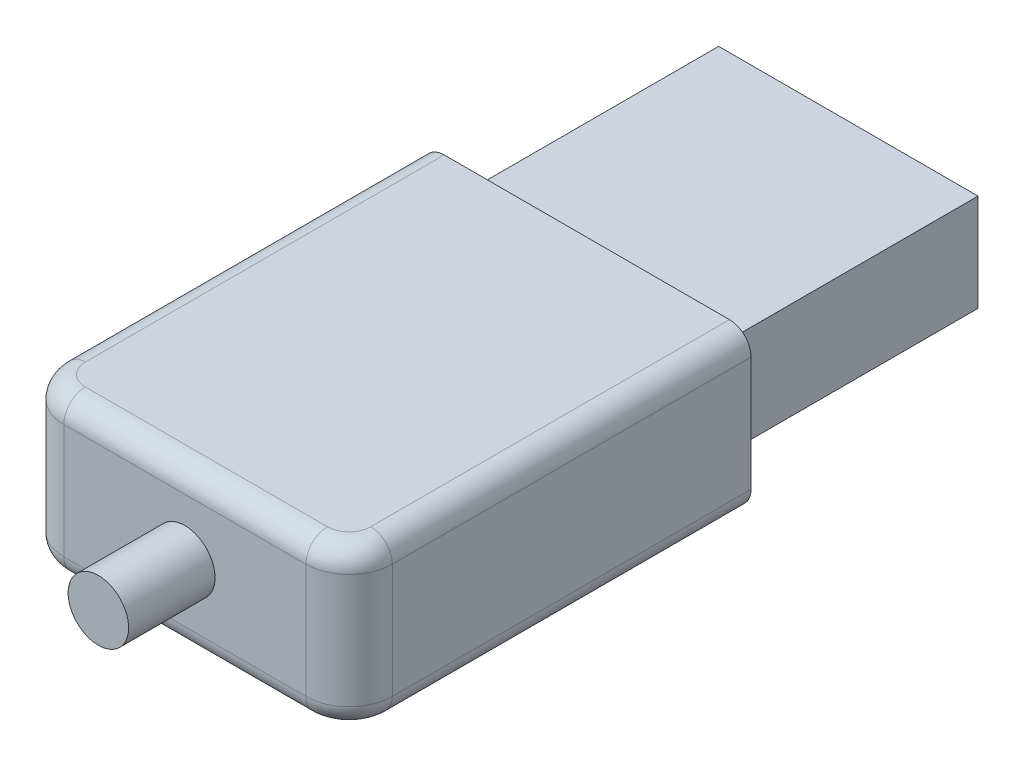
ISO-10303-21;
HEADER;
FILE_DESCRIPTION(('STEP AP214'),'2;1');
FILE_NAME('part.step','',(''),(''),'','','');
FILE_SCHEMA(('AUTOMOTIVE_DESIGN { 1 0 10303 214 1 1 1 1 }'));
ENDSEC;
DATA;
#1=APPLICATION_CONTEXT('core data for automotive mechanical design processes');
#2=APPLICATION_PROTOCOL_DEFINITION('international standard','automotive_design',2000,#1);
#3=PRODUCT_CONTEXT('',#1,'mechanical');
#4=PRODUCT('Part','Part','',(#3));
#5=PRODUCT_RELATED_PRODUCT_CATEGORY('part','',(#4));
#6=PRODUCT_DEFINITION_FORMATION('','',#4);
#7=PRODUCT_DEFINITION_CONTEXT('part definition',#1,'design');
#8=PRODUCT_DEFINITION('design','',#6,#7);
#9=PRODUCT_DEFINITION_SHAPE('','',#8);
#10=(LENGTH_UNIT() NAMED_UNIT(*) SI_UNIT(.MILLI.,.METRE.));
#11=(NAMED_UNIT(*) PLANE_ANGLE_UNIT() SI_UNIT($,.RADIAN.));
#12=(NAMED_UNIT(*) SI_UNIT($,.STERADIAN.) SOLID_ANGLE_UNIT());
#13=UNCERTAINTY_MEASURE_WITH_UNIT(LENGTH_MEASURE(1.E-05),#10,'distance_accuracy_value','');
#14=(GEOMETRIC_REPRESENTATION_CONTEXT(3) GLOBAL_UNCERTAINTY_ASSIGNED_CONTEXT((#13)) GLOBAL_UNIT_ASSIGNED_CONTEXT((#10,
#11,#12)) REPRESENTATION_CONTEXT('',''));
#15=CARTESIAN_POINT('',(0.,0.,0.));
#16=DIRECTION('',(0.,0.,1.));
#17=DIRECTION('',(1.,0.,0.));
#18=AXIS2_PLACEMENT_3D('',#15,#16,#17);
#19=CARTESIAN_POINT('',(0.,0.,0.));
#20=DIRECTION('',(0.,0.,1.));
#21=DIRECTION('',(1.,0.,0.));
#22=AXIS2_PLACEMENT_3D('',#19,#20,#21);
#23=PLANE('',#22);
#24=DIRECTION('',(1.,0.,0.));
#25=VECTOR('',#24,1.);
#26=CARTESIAN_POINT('',(-7.6,-3.65,0.));
#27=LINE('',#26,#25);
#28=CARTESIAN_POINT('',(-6.6,-3.65,0.));
#29=VERTEX_POINT('',#28);
#30=CARTESIAN_POINT('',(6.6,-3.65,0.));
#31=VERTEX_POINT('',#30);
#32=EDGE_CURVE('E260',#29,#31,#27,.T.);
#33=ORIENTED_EDGE('',*,*,#32,.F.);
#34=CARTESIAN_POINT('',(-6.6,-2.65,0.));
#35=DIRECTION('',(0.,0.,1.));
#36=DIRECTION('',(1.,0.,0.));
#37=AXIS2_PLACEMENT_3D('',#34,#35,#36);
#38=CIRCLE('',#37,1.);
#39=CARTESIAN_POINT('',(-7.6,-2.65,0.));
#40=VERTEX_POINT('',#39);
#41=EDGE_CURVE('E12',#29,#40,#38,.F.);
#42=ORIENTED_EDGE('',*,*,#41,.T.);
#43=DIRECTION('',(0.,-1.,0.));
#44=VECTOR('',#43,1.);
#45=CARTESIAN_POINT('',(-7.6,3.65,0.));
#46=LINE('',#45,#44);
#47=CARTESIAN_POINT('',(-7.6,2.65,0.));
#48=VERTEX_POINT('',#47);
#49=EDGE_CURVE('E257',#48,#40,#46,.T.);
#50=ORIENTED_EDGE('',*,*,#49,.F.);
#51=CARTESIAN_POINT('',(-6.6,2.65,0.));
#52=DIRECTION('',(0.,0.,1.));
#53=DIRECTION('',(1.,0.,0.));
#54=AXIS2_PLACEMENT_3D('',#51,#52,#53);
#55=CIRCLE('',#54,1.);
#56=CARTESIAN_POINT('',(-6.6,3.65,0.));
#57=VERTEX_POINT('',#56);
#58=EDGE_CURVE('E306',#48,#57,#55,.F.);
#59=ORIENTED_EDGE('',*,*,#58,.T.);
#60=DIRECTION('',(-1.,0.,0.));
#61=VECTOR('',#60,1.);
#62=CARTESIAN_POINT('',(-7.6,3.65,0.));
#63=LINE('',#62,#61);
#64=CARTESIAN_POINT('',(6.6,3.65,0.));
#65=VERTEX_POINT('',#64);
#66=EDGE_CURVE('E254',#65,#57,#63,.T.);
#67=ORIENTED_EDGE('',*,*,#66,.F.);
#68=CARTESIAN_POINT('',(6.6,2.65,0.));
#69=DIRECTION('',(0.,0.,1.));
#70=DIRECTION('',(1.,0.,0.));
#71=AXIS2_PLACEMENT_3D('',#68,#69,#70);
#72=CIRCLE('',#71,1.);
#73=CARTESIAN_POINT('',(7.6,2.65,0.));
#74=VERTEX_POINT('',#73);
#75=EDGE_CURVE('E308',#65,#74,#72,.F.);
#76=ORIENTED_EDGE('',*,*,#75,.T.);
#77=DIRECTION('',(0.,1.,0.));
#78=VECTOR('',#77,1.);
#79=CARTESIAN_POINT('',(7.6,3.65,0.));
#80=LINE('',#79,#78);
#81=CARTESIAN_POINT('',(7.6,-2.65,0.));
#82=VERTEX_POINT('',#81);
#83=EDGE_CURVE('E251',#82,#74,#80,.T.);
#84=ORIENTED_EDGE('',*,*,#83,.F.);
#85=CARTESIAN_POINT('',(6.6,-2.65,0.));
#86=DIRECTION('',(0.,0.,1.));
#87=DIRECTION('',(1.,0.,0.));
#88=AXIS2_PLACEMENT_3D('',#85,#86,#87);
#89=CIRCLE('',#88,1.);
#90=EDGE_CURVE('E45',#82,#31,#89,.F.);
#91=ORIENTED_EDGE('',*,*,#90,.T.);
#92=EDGE_LOOP('',(#33,#42,#50,#59,#67,#76,#84,#91));
#93=FACE_BOUND('',#92,.T.);
#94=DIRECTION('',(0.,1.,0.));
#95=VECTOR('',#94,1.);
#96=CARTESIAN_POINT('',(-6.,2.25,0.));
#97=LINE('',#96,#95);
#98=CARTESIAN_POINT('',(-6.,-2.25,0.));
#99=VERTEX_POINT('',#98);
#100=CARTESIAN_POINT('',(-6.,2.25,0.));
#101=VERTEX_POINT('',#100);
#102=EDGE_CURVE('E215',#99,#101,#97,.T.);
#103=ORIENTED_EDGE('',*,*,#102,.F.);
#104=DIRECTION('',(-1.,0.,0.));
#105=VECTOR('',#104,1.);
#106=CARTESIAN_POINT('',(6.,-2.25,0.));
#107=LINE('',#106,#105);
#108=CARTESIAN_POINT('',(6.,-2.25,0.));
#109=VERTEX_POINT('',#108);
#110=EDGE_CURVE('E223',#109,#99,#107,.T.);
#111=ORIENTED_EDGE('',*,*,#110,.F.);
#112=DIRECTION('',(0.,-1.,0.));
#113=VECTOR('',#112,1.);
#114=CARTESIAN_POINT('',(6.,2.25,0.));
#115=LINE('',#114,#113);
#116=CARTESIAN_POINT('',(6.,2.25,0.));
#117=VERTEX_POINT('',#116);
#118=EDGE_CURVE('E235',#117,#109,#115,.T.);
#119=ORIENTED_EDGE('',*,*,#118,.F.);
#120=DIRECTION('',(1.,0.,0.));
#121=VECTOR('',#120,1.);
#122=CARTESIAN_POINT('',(6.,2.25,0.));
#123=LINE('',#122,#121);
#124=EDGE_CURVE('E232',#101,#117,#123,.T.);
#125=ORIENTED_EDGE('',*,*,#124,.F.);
#126=EDGE_LOOP('',(#103,#111,#119,#125));
#127=FACE_BOUND('',#126,.T.);
#128=ADVANCED_FACE('F36',(#93,#127),#23,.F.);
#129=CARTESIAN_POINT('',(7.6,3.65,18.6));
#130=DIRECTION('',(-1.,0.,0.));
#131=DIRECTION('',(0.,0.,1.));
#132=AXIS2_PLACEMENT_3D('',#129,#130,#131);
#133=PLANE('',#132);
#134=DIRECTION('',(0.,1.,0.));
#135=VECTOR('',#134,1.);
#136=CARTESIAN_POINT('',(7.6,-3.65,16.6));
#137=LINE('',#136,#135);
#138=CARTESIAN_POINT('',(7.6,2.65,16.6));
#139=VERTEX_POINT('',#138);
#140=CARTESIAN_POINT('',(7.6,-2.65,16.6));
#141=VERTEX_POINT('',#140);
#142=EDGE_CURVE('E274',#139,#141,#137,.F.);
#143=ORIENTED_EDGE('',*,*,#142,.T.);
#144=DIRECTION('',(0.,0.,-1.));
#145=VECTOR('',#144,1.);
#146=CARTESIAN_POINT('',(7.6,-2.65,18.6));
#147=LINE('',#146,#145);
#148=EDGE_CURVE('E277',#141,#82,#147,.T.);
#149=ORIENTED_EDGE('',*,*,#148,.T.);
#150=ORIENTED_EDGE('',*,*,#83,.T.);
#151=DIRECTION('',(0.,0.,-1.));
#152=VECTOR('',#151,1.);
#153=CARTESIAN_POINT('',(7.6,2.65,18.6));
#154=LINE('',#153,#152);
#155=EDGE_CURVE('E272',#74,#139,#154,.F.);
#156=ORIENTED_EDGE('',*,*,#155,.T.);
#157=EDGE_LOOP('',(#143,#149,#150,#156));
#158=FACE_BOUND('',#157,.T.);
#159=ADVANCED_FACE('F374',(#158),#133,.F.);
#160=CARTESIAN_POINT('',(-7.6,3.65,18.6));
#161=DIRECTION('',(0.,-1.,0.));
#162=DIRECTION('',(0.,0.,-1.));
#163=AXIS2_PLACEMENT_3D('',#160,#161,#162);
#164=PLANE('',#163);
#165=CARTESIAN_POINT('',(5.6,3.65,16.6));
#166=DIRECTION('',(0.,-1.,0.));
#167=DIRECTION('',(0.,0.,-1.));
#168=AXIS2_PLACEMENT_3D('',#165,#166,#167);
#169=CIRCLE('',#168,1.);
#170=CARTESIAN_POINT('',(6.6,3.65,16.6));
#171=VERTEX_POINT('',#170);
#172=CARTESIAN_POINT('',(5.6,3.65,17.6));
#173=VERTEX_POINT('',#172);
#174=EDGE_CURVE('E292',#171,#173,#169,.T.);
#175=ORIENTED_EDGE('',*,*,#174,.F.);
#176=DIRECTION('',(0.,0.,-1.));
#177=VECTOR('',#176,1.);
#178=CARTESIAN_POINT('',(6.6,3.65,18.6));
#179=LINE('',#178,#177);
#180=EDGE_CURVE('E295',#171,#65,#179,.T.);
#181=ORIENTED_EDGE('',*,*,#180,.T.);
#182=ORIENTED_EDGE('',*,*,#66,.T.);
#183=DIRECTION('',(0.,0.,-1.));
#184=VECTOR('',#183,1.);
#185=CARTESIAN_POINT('',(-6.6,3.65,18.6));
#186=LINE('',#185,#184);
#187=CARTESIAN_POINT('',(-6.6,3.65,16.6));
#188=VERTEX_POINT('',#187);
#189=EDGE_CURVE('E288',#57,#188,#186,.F.);
#190=ORIENTED_EDGE('',*,*,#189,.T.);
#191=CARTESIAN_POINT('',(-5.6,3.65,16.6));
#192=DIRECTION('',(0.,-1.,0.));
#193=DIRECTION('',(0.,0.,-1.));
#194=AXIS2_PLACEMENT_3D('',#191,#192,#193);
#195=CIRCLE('',#194,1.);
#196=CARTESIAN_POINT('',(-5.6,3.65,17.6));
#197=VERTEX_POINT('',#196);
#198=EDGE_CURVE('E285',#197,#188,#195,.T.);
#199=ORIENTED_EDGE('',*,*,#198,.F.);
#200=DIRECTION('',(-1.,0.,0.));
#201=VECTOR('',#200,1.);
#202=CARTESIAN_POINT('',(7.6,3.65,17.6));
#203=LINE('',#202,#201);
#204=EDGE_CURVE('E290',#197,#173,#203,.F.);
#205=ORIENTED_EDGE('',*,*,#204,.T.);
#206=EDGE_LOOP('',(#175,#181,#182,#190,#199,#205));
#207=FACE_BOUND('',#206,.T.);
#208=ADVANCED_FACE('F379',(#207),#164,.F.);
#209=CARTESIAN_POINT('',(-7.6,3.65,18.6));
#210=DIRECTION('',(1.,0.,0.));
#211=DIRECTION('',(0.,1.,0.));
#212=AXIS2_PLACEMENT_3D('',#209,#210,#211);
#213=PLANE('',#212);
#214=ORIENTED_EDGE('',*,*,#49,.T.);
#215=DIRECTION('',(0.,0.,-1.));
#216=VECTOR('',#215,1.);
#217=CARTESIAN_POINT('',(-7.6,-2.65,18.6));
#218=LINE('',#217,#216);
#219=CARTESIAN_POINT('',(-7.6,-2.65,16.6));
#220=VERTEX_POINT('',#219);
#221=EDGE_CURVE('E283',#40,#220,#218,.F.);
#222=ORIENTED_EDGE('',*,*,#221,.T.);
#223=DIRECTION('',(0.,-1.,0.));
#224=VECTOR('',#223,1.);
#225=CARTESIAN_POINT('',(-7.6,3.65,16.6));
#226=LINE('',#225,#224);
#227=CARTESIAN_POINT('',(-7.6,2.65,16.6));
#228=VERTEX_POINT('',#227);
#229=EDGE_CURVE('E281',#220,#228,#226,.F.);
#230=ORIENTED_EDGE('',*,*,#229,.T.);
#231=DIRECTION('',(0.,0.,-1.));
#232=VECTOR('',#231,1.);
#233=CARTESIAN_POINT('',(-7.6,2.65,18.6));
#234=LINE('',#233,#232);
#235=EDGE_CURVE('E279',#228,#48,#234,.T.);
#236=ORIENTED_EDGE('',*,*,#235,.T.);
#237=EDGE_LOOP('',(#214,#222,#230,#236));
#238=FACE_BOUND('',#237,.T.);
#239=ADVANCED_FACE('F370',(#238),#213,.F.);
#240=CARTESIAN_POINT('',(-7.6,-3.65,18.6));
#241=DIRECTION('',(0.,1.,0.));
#242=DIRECTION('',(0.,0.,1.));
#243=AXIS2_PLACEMENT_3D('',#240,#241,#242);
#244=PLANE('',#243);
#245=CARTESIAN_POINT('',(-5.6,-3.65,16.6));
#246=DIRECTION('',(0.,1.,0.));
#247=DIRECTION('',(0.,0.,1.));
#248=AXIS2_PLACEMENT_3D('',#245,#246,#247);
#249=CIRCLE('',#248,1.);
#250=CARTESIAN_POINT('',(-6.6,-3.65,16.6));
#251=VERTEX_POINT('',#250);
#252=CARTESIAN_POINT('',(-5.6,-3.65,17.6));
#253=VERTEX_POINT('',#252);
#254=EDGE_CURVE('E53',#251,#253,#249,.T.);
#255=ORIENTED_EDGE('',*,*,#254,.F.);
#256=DIRECTION('',(0.,0.,-1.));
#257=VECTOR('',#256,1.);
#258=CARTESIAN_POINT('',(-6.6,-3.65,18.6));
#259=LINE('',#258,#257);
#260=EDGE_CURVE('E304',#251,#29,#259,.T.);
#261=ORIENTED_EDGE('',*,*,#260,.T.);
#262=ORIENTED_EDGE('',*,*,#32,.T.);
#263=DIRECTION('',(0.,0.,-1.));
#264=VECTOR('',#263,1.);
#265=CARTESIAN_POINT('',(6.6,-3.65,18.6));
#266=LINE('',#265,#264);
#267=CARTESIAN_POINT('',(6.6,-3.65,16.6));
#268=VERTEX_POINT('',#267);
#269=EDGE_CURVE('E300',#31,#268,#266,.F.);
#270=ORIENTED_EDGE('',*,*,#269,.T.);
#271=CARTESIAN_POINT('',(5.6,-3.65,16.6));
#272=DIRECTION('',(0.,1.,0.));
#273=DIRECTION('',(0.,0.,1.));
#274=AXIS2_PLACEMENT_3D('',#271,#272,#273);
#275=CIRCLE('',#274,1.);
#276=CARTESIAN_POINT('',(5.6,-3.65,17.6));
#277=VERTEX_POINT('',#276);
#278=EDGE_CURVE('E297',#277,#268,#275,.T.);
#279=ORIENTED_EDGE('',*,*,#278,.F.);
#280=DIRECTION('',(1.,0.,0.));
#281=VECTOR('',#280,1.);
#282=CARTESIAN_POINT('',(-7.6,-3.65,17.6));
#283=LINE('',#282,#281);
#284=EDGE_CURVE('E58',#277,#253,#283,.F.);
#285=ORIENTED_EDGE('',*,*,#284,.T.);
#286=EDGE_LOOP('',(#255,#261,#262,#270,#279,#285));
#287=FACE_BOUND('',#286,.T.);
#288=ADVANCED_FACE('F360',(#287),#244,.F.);
#289=CARTESIAN_POINT('',(0.,0.,18.6));
#290=DIRECTION('',(0.,0.,1.));
#291=DIRECTION('',(1.,0.,0.));
#292=AXIS2_PLACEMENT_3D('',#289,#290,#291);
#293=PLANE('',#292);
#294=DIRECTION('',(0.,1.,0.));
#295=VECTOR('',#294,1.);
#296=CARTESIAN_POINT('',(5.6,3.65,18.6));
#297=LINE('',#296,#295);
#298=CARTESIAN_POINT('',(5.6,-2.65,18.6));
#299=VERTEX_POINT('',#298);
#300=CARTESIAN_POINT('',(5.6,2.65,18.6));
#301=VERTEX_POINT('',#300);
#302=EDGE_CURVE('E267',#299,#301,#297,.T.);
#303=ORIENTED_EDGE('',*,*,#302,.T.);
#304=DIRECTION('',(-1.,0.,0.));
#305=VECTOR('',#304,1.);
#306=CARTESIAN_POINT('',(-7.6,2.65,18.6));
#307=LINE('',#306,#305);
#308=CARTESIAN_POINT('',(-5.6,2.65,18.6));
#309=VERTEX_POINT('',#308);
#310=EDGE_CURVE('E270',#301,#309,#307,.T.);
#311=ORIENTED_EDGE('',*,*,#310,.T.);
#312=DIRECTION('',(0.,-1.,0.));
#313=VECTOR('',#312,1.);
#314=CARTESIAN_POINT('',(-5.6,-3.65,18.6));
#315=LINE('',#314,#313);
#316=CARTESIAN_POINT('',(-5.6,-2.65,18.6));
#317=VERTEX_POINT('',#316);
#318=EDGE_CURVE('E265',#309,#317,#315,.T.);
#319=ORIENTED_EDGE('',*,*,#318,.T.);
#320=DIRECTION('',(1.,0.,0.));
#321=VECTOR('',#320,1.);
#322=CARTESIAN_POINT('',(7.6,-2.65,18.6));
#323=LINE('',#322,#321);
#324=EDGE_CURVE('E263',#317,#299,#323,.T.);
#325=ORIENTED_EDGE('',*,*,#324,.T.);
#326=EDGE_LOOP('',(#303,#311,#319,#325));
#327=FACE_BOUND('',#326,.T.);
#328=CARTESIAN_POINT('',(0.,0.,18.6));
#329=DIRECTION('',(0.,0.,1.));
#330=DIRECTION('',(1.,0.,0.));
#331=AXIS2_PLACEMENT_3D('',#328,#329,#330);
#332=CIRCLE('',#331,1.4);
#333=CARTESIAN_POINT('',(1.4,0.,18.6));
#334=VERTEX_POINT('',#333);
#335=EDGE_CURVE('E202',#334,#334,#332,.T.);
#336=ORIENTED_EDGE('',*,*,#335,.F.);
#337=EDGE_LOOP('',(#336));
#338=FACE_BOUND('',#337,.T.);
#339=ADVANCED_FACE('F357',(#327,#338),#293,.T.);
#340=CARTESIAN_POINT('',(-6.,2.25,-12.1));
#341=DIRECTION('',(1.,0.,0.));
#342=DIRECTION('',(0.,1.,0.));
#343=AXIS2_PLACEMENT_3D('',#340,#341,#342);
#344=PLANE('',#343);
#345=ORIENTED_EDGE('',*,*,#102,.T.);
#346=DIRECTION('',(0.,0.,1.));
#347=VECTOR('',#346,1.);
#348=CARTESIAN_POINT('',(-6.,2.25,-12.1));
#349=LINE('',#348,#347);
#350=CARTESIAN_POINT('',(-6.,2.25,-12.1));
#351=VERTEX_POINT('',#350);
#352=EDGE_CURVE('E248',#351,#101,#349,.T.);
#353=ORIENTED_EDGE('',*,*,#352,.F.);
#354=DIRECTION('',(0.,1.,0.));
#355=VECTOR('',#354,1.);
#356=CARTESIAN_POINT('',(-6.,2.25,-12.1));
#357=LINE('',#356,#355);
#358=CARTESIAN_POINT('',(-6.,-2.25,-12.1));
#359=VERTEX_POINT('',#358);
#360=EDGE_CURVE('E219',#359,#351,#357,.T.);
#361=ORIENTED_EDGE('',*,*,#360,.F.);
#362=DIRECTION('',(0.,0.,1.));
#363=VECTOR('',#362,1.);
#364=CARTESIAN_POINT('',(-6.,-2.25,-12.1));
#365=LINE('',#364,#363);
#366=EDGE_CURVE('E229',#359,#99,#365,.T.);
#367=ORIENTED_EDGE('',*,*,#366,.T.);
#368=EDGE_LOOP('',(#345,#353,#361,#367));
#369=FACE_BOUND('',#368,.T.);
#370=ADVANCED_FACE('F359',(#369),#344,.F.);
#371=CARTESIAN_POINT('',(6.,2.25,-12.1));
#372=DIRECTION('',(0.,-1.,0.));
#373=DIRECTION('',(0.,0.,-1.));
#374=AXIS2_PLACEMENT_3D('',#371,#372,#373);
#375=PLANE('',#374);
#376=ORIENTED_EDGE('',*,*,#124,.T.);
#377=DIRECTION('',(0.,0.,1.));
#378=VECTOR('',#377,1.);
#379=CARTESIAN_POINT('',(6.,2.25,-12.1));
#380=LINE('',#379,#378);
#381=CARTESIAN_POINT('',(6.,2.25,-12.1));
#382=VERTEX_POINT('',#381);
#383=EDGE_CURVE('E245',#382,#117,#380,.T.);
#384=ORIENTED_EDGE('',*,*,#383,.F.);
#385=DIRECTION('',(1.,0.,0.));
#386=VECTOR('',#385,1.);
#387=CARTESIAN_POINT('',(6.,2.25,-12.1));
#388=LINE('',#387,#386);
#389=EDGE_CURVE('E222',#351,#382,#388,.T.);
#390=ORIENTED_EDGE('',*,*,#389,.F.);
#391=ORIENTED_EDGE('',*,*,#352,.T.);
#392=EDGE_LOOP('',(#376,#384,#390,#391));
#393=FACE_BOUND('',#392,.T.);
#394=ADVANCED_FACE('F367',(#393),#375,.F.);
#395=CARTESIAN_POINT('',(6.,2.25,-12.1));
#396=DIRECTION('',(-1.,0.,0.));
#397=DIRECTION('',(0.,-1.,0.));
#398=AXIS2_PLACEMENT_3D('',#395,#396,#397);
#399=PLANE('',#398);
#400=ORIENTED_EDGE('',*,*,#118,.T.);
#401=DIRECTION('',(0.,0.,1.));
#402=VECTOR('',#401,1.);
#403=CARTESIAN_POINT('',(6.,-2.25,-12.1));
#404=LINE('',#403,#402);
#405=CARTESIAN_POINT('',(6.,-2.25,-12.1));
#406=VERTEX_POINT('',#405);
#407=EDGE_CURVE('E242',#406,#109,#404,.T.);
#408=ORIENTED_EDGE('',*,*,#407,.F.);
#409=DIRECTION('',(0.,-1.,0.));
#410=VECTOR('',#409,1.);
#411=CARTESIAN_POINT('',(6.,2.25,-12.1));
#412=LINE('',#411,#410);
#413=EDGE_CURVE('E225',#382,#406,#412,.T.);
#414=ORIENTED_EDGE('',*,*,#413,.F.);
#415=ORIENTED_EDGE('',*,*,#383,.T.);
#416=EDGE_LOOP('',(#400,#408,#414,#415));
#417=FACE_BOUND('',#416,.T.);
#418=ADVANCED_FACE('F494',(#417),#399,.F.);
#419=CARTESIAN_POINT('',(6.,-2.25,-12.1));
#420=DIRECTION('',(0.,1.,0.));
#421=DIRECTION('',(0.,0.,1.));
#422=AXIS2_PLACEMENT_3D('',#419,#420,#421);
#423=PLANE('',#422);
#424=ORIENTED_EDGE('',*,*,#110,.T.);
#425=ORIENTED_EDGE('',*,*,#366,.F.);
#426=DIRECTION('',(-1.,0.,0.));
#427=VECTOR('',#426,1.);
#428=CARTESIAN_POINT('',(6.,-2.25,-12.1));
#429=LINE('',#428,#427);
#430=EDGE_CURVE('E227',#406,#359,#429,.T.);
#431=ORIENTED_EDGE('',*,*,#430,.F.);
#432=ORIENTED_EDGE('',*,*,#407,.T.);
#433=EDGE_LOOP('',(#424,#425,#431,#432));
#434=FACE_BOUND('',#433,.T.);
#435=ADVANCED_FACE('F490',(#434),#423,.F.);
#436=CARTESIAN_POINT('',(0.,0.,-12.1));
#437=DIRECTION('',(0.,0.,-1.));
#438=DIRECTION('',(-1.,0.,0.));
#439=AXIS2_PLACEMENT_3D('',#436,#437,#438);
#440=PLANE('',#439);
#441=DIRECTION('',(0.,-1.,0.));
#442=VECTOR('',#441,1.);
#443=CARTESIAN_POINT('',(5.8,2.05,-12.1));
#444=LINE('',#443,#442);
#445=CARTESIAN_POINT('',(5.8,2.05,-12.1));
#446=VERTEX_POINT('',#445);
#447=CARTESIAN_POINT('',(5.8,-0.15,-12.1));
#448=VERTEX_POINT('',#447);
#449=EDGE_CURVE('E179',#446,#448,#444,.T.);
#450=ORIENTED_EDGE('',*,*,#449,.F.);
#451=DIRECTION('',(1.,0.,0.));
#452=VECTOR('',#451,1.);
#453=CARTESIAN_POINT('',(5.8,2.05,-12.1));
#454=LINE('',#453,#452);
#455=CARTESIAN_POINT('',(-5.8,2.05,-12.1));
#456=VERTEX_POINT('',#455);
#457=EDGE_CURVE('E196',#456,#446,#454,.T.);
#458=ORIENTED_EDGE('',*,*,#457,.F.);
#459=DIRECTION('',(0.,1.,0.));
#460=VECTOR('',#459,1.);
#461=CARTESIAN_POINT('',(-5.8,2.05,-12.1));
#462=LINE('',#461,#460);
#463=CARTESIAN_POINT('',(-5.8,-0.15,-12.1));
#464=VERTEX_POINT('',#463);
#465=EDGE_CURVE('E199',#464,#456,#462,.T.);
#466=ORIENTED_EDGE('',*,*,#465,.F.);
#467=DIRECTION('',(-1.,0.,0.));
#468=VECTOR('',#467,1.);
#469=CARTESIAN_POINT('',(5.8,-0.15,-12.1));
#470=LINE('',#469,#468);
#471=EDGE_CURVE('E208',#448,#464,#470,.T.);
#472=ORIENTED_EDGE('',*,*,#471,.F.);
#473=EDGE_LOOP('',(#450,#458,#466,#472));
#474=FACE_BOUND('',#473,.T.);
#475=ORIENTED_EDGE('',*,*,#360,.T.);
#476=ORIENTED_EDGE('',*,*,#389,.T.);
#477=ORIENTED_EDGE('',*,*,#413,.T.);
#478=ORIENTED_EDGE('',*,*,#430,.T.);
#479=EDGE_LOOP('',(#475,#476,#477,#478));
#480=FACE_BOUND('',#479,.T.);
#481=ADVANCED_FACE('F487',(#474,#480),#440,.T.);
#482=CARTESIAN_POINT('',(5.8,2.05,-3.1));
#483=DIRECTION('',(1.,0.,0.));
#484=DIRECTION('',(0.,1.,0.));
#485=AXIS2_PLACEMENT_3D('',#482,#483,#484);
#486=PLANE('',#485);
#487=ORIENTED_EDGE('',*,*,#449,.T.);
#488=DIRECTION('',(0.,0.,-1.));
#489=VECTOR('',#488,1.);
#490=CARTESIAN_POINT('',(5.8,-0.15,-3.1));
#491=LINE('',#490,#489);
#492=CARTESIAN_POINT('',(5.8,-0.15,-3.1));
#493=VERTEX_POINT('',#492);
#494=EDGE_CURVE('E172',#493,#448,#491,.T.);
#495=ORIENTED_EDGE('',*,*,#494,.F.);
#496=DIRECTION('',(0.,-1.,0.));
#497=VECTOR('',#496,1.);
#498=CARTESIAN_POINT('',(5.8,2.05,-3.1));
#499=LINE('',#498,#497);
#500=CARTESIAN_POINT('',(5.8,2.05,-3.1));
#501=VERTEX_POINT('',#500);
#502=EDGE_CURVE('E176',#501,#493,#499,.T.);
#503=ORIENTED_EDGE('',*,*,#502,.F.);
#504=DIRECTION('',(0.,0.,-1.));
#505=VECTOR('',#504,1.);
#506=CARTESIAN_POINT('',(5.8,2.05,-3.1));
#507=LINE('',#506,#505);
#508=EDGE_CURVE('E213',#501,#446,#507,.T.);
#509=ORIENTED_EDGE('',*,*,#508,.T.);
#510=EDGE_LOOP('',(#487,#495,#503,#509));
#511=FACE_BOUND('',#510,.T.);
#512=ADVANCED_FACE('F174',(#511),#486,.F.);
#513=CARTESIAN_POINT('',(5.8,2.05,-3.1));
#514=DIRECTION('',(0.,1.,0.));
#515=DIRECTION('',(0.,0.,1.));
#516=AXIS2_PLACEMENT_3D('',#513,#514,#515);
#517=PLANE('',#516);
#518=ORIENTED_EDGE('',*,*,#457,.T.);
#519=ORIENTED_EDGE('',*,*,#508,.F.);
#520=DIRECTION('',(1.,0.,0.));
#521=VECTOR('',#520,1.);
#522=CARTESIAN_POINT('',(5.8,2.05,-3.1));
#523=LINE('',#522,#521);
#524=CARTESIAN_POINT('',(-5.8,2.05,-3.1));
#525=VERTEX_POINT('',#524);
#526=EDGE_CURVE('E184',#525,#501,#523,.T.);
#527=ORIENTED_EDGE('',*,*,#526,.F.);
#528=DIRECTION('',(0.,0.,-1.));
#529=VECTOR('',#528,1.);
#530=CARTESIAN_POINT('',(-5.8,2.05,-3.1));
#531=LINE('',#530,#529);
#532=EDGE_CURVE('E216',#525,#456,#531,.T.);
#533=ORIENTED_EDGE('',*,*,#532,.T.);
#534=EDGE_LOOP('',(#518,#519,#527,#533));
#535=FACE_BOUND('',#534,.T.);
#536=ADVANCED_FACE('F475',(#535),#517,.F.);
#537=CARTESIAN_POINT('',(-5.8,2.05,-3.1));
#538=DIRECTION('',(-1.,0.,0.));
#539=DIRECTION('',(0.,0.,1.));
#540=AXIS2_PLACEMENT_3D('',#537,#538,#539);
#541=PLANE('',#540);
#542=ORIENTED_EDGE('',*,*,#465,.T.);
#543=ORIENTED_EDGE('',*,*,#532,.F.);
#544=DIRECTION('',(0.,1.,0.));
#545=VECTOR('',#544,1.);
#546=CARTESIAN_POINT('',(-5.8,2.05,-3.1));
#547=LINE('',#546,#545);
#548=CARTESIAN_POINT('',(-5.8,-0.15,-3.1));
#549=VERTEX_POINT('',#548);
#550=EDGE_CURVE('E192',#549,#525,#547,.T.);
#551=ORIENTED_EDGE('',*,*,#550,.F.);
#552=DIRECTION('',(0.,0.,-1.));
#553=VECTOR('',#552,1.);
#554=CARTESIAN_POINT('',(-5.8,-0.15,-3.1));
#555=LINE('',#554,#553);
#556=EDGE_CURVE('E183',#549,#464,#555,.T.);
#557=ORIENTED_EDGE('',*,*,#556,.T.);
#558=EDGE_LOOP('',(#542,#543,#551,#557));
#559=FACE_BOUND('',#558,.T.);
#560=ADVANCED_FACE('F478',(#559),#541,.F.);
#561=CARTESIAN_POINT('',(5.8,-0.15,-3.1));
#562=DIRECTION('',(0.,-1.,0.));
#563=DIRECTION('',(0.,0.,-1.));
#564=AXIS2_PLACEMENT_3D('',#561,#562,#563);
#565=PLANE('',#564);
#566=ORIENTED_EDGE('',*,*,#471,.T.);
#567=ORIENTED_EDGE('',*,*,#556,.F.);
#568=DIRECTION('',(-1.,0.,0.));
#569=VECTOR('',#568,1.);
#570=CARTESIAN_POINT('',(5.8,-0.15,-3.1));
#571=LINE('',#570,#569);
#572=EDGE_CURVE('E187',#493,#549,#571,.T.);
#573=ORIENTED_EDGE('',*,*,#572,.F.);
#574=ORIENTED_EDGE('',*,*,#494,.T.);
#575=EDGE_LOOP('',(#566,#567,#573,#574));
#576=FACE_BOUND('',#575,.T.);
#577=ADVANCED_FACE('F188',(#576),#565,.F.);
#578=CARTESIAN_POINT('',(0.,0.,-3.1));
#579=DIRECTION('',(0.,0.,-1.));
#580=DIRECTION('',(-1.,0.,0.));
#581=AXIS2_PLACEMENT_3D('',#578,#579,#580);
#582=PLANE('',#581);
#583=ORIENTED_EDGE('',*,*,#502,.T.);
#584=ORIENTED_EDGE('',*,*,#572,.T.);
#585=ORIENTED_EDGE('',*,*,#550,.T.);
#586=ORIENTED_EDGE('',*,*,#526,.T.);
#587=EDGE_LOOP('',(#583,#584,#585,#586));
#588=FACE_BOUND('',#587,.T.);
#589=ADVANCED_FACE('F194',(#588),#582,.T.);
#590=CARTESIAN_POINT('',(0.,0.,22.6));
#591=DIRECTION('',(0.,0.,-1.));
#592=DIRECTION('',(-1.,0.,0.));
#593=AXIS2_PLACEMENT_3D('',#590,#591,#592);
#594=CYLINDRICAL_SURFACE('',#593,1.4);
#595=CARTESIAN_POINT('',(0.,0.,22.6));
#596=DIRECTION('',(0.,0.,1.));
#597=DIRECTION('',(1.,0.,0.));
#598=AXIS2_PLACEMENT_3D('',#595,#596,#597);
#599=CIRCLE('',#598,1.4);
#600=CARTESIAN_POINT('',(1.4,0.,22.6));
#601=VERTEX_POINT('',#600);
#602=EDGE_CURVE('E209',#601,#601,#599,.T.);
#603=ORIENTED_EDGE('',*,*,#602,.F.);
#604=EDGE_LOOP('',(#603));
#605=FACE_BOUND('',#604,.T.);
#606=ORIENTED_EDGE('',*,*,#335,.T.);
#607=EDGE_LOOP('',(#606));
#608=FACE_BOUND('',#607,.T.);
#609=ADVANCED_FACE('F350',(#605,#608),#594,.T.);
#610=CARTESIAN_POINT('',(0.,0.,22.6));
#611=DIRECTION('',(0.,0.,1.));
#612=DIRECTION('',(1.,0.,0.));
#613=AXIS2_PLACEMENT_3D('',#610,#611,#612);
#614=PLANE('',#613);
#615=ORIENTED_EDGE('',*,*,#602,.T.);
#616=EDGE_LOOP('',(#615));
#617=FACE_BOUND('',#616,.T.);
#618=ADVANCED_FACE('F348',(#617),#614,.T.);
#619=CARTESIAN_POINT('',(-6.6,-2.65,18.6));
#620=DIRECTION('',(0.,0.,-1.));
#621=DIRECTION('',(-1.,0.,0.));
#622=AXIS2_PLACEMENT_3D('',#619,#620,#621);
#623=CYLINDRICAL_SURFACE('',#622,1.);
#624=ORIENTED_EDGE('',*,*,#41,.F.);
#625=ORIENTED_EDGE('',*,*,#260,.F.);
#626=CARTESIAN_POINT('',(-6.6,-2.65,16.6));
#627=DIRECTION('',(0.,0.,1.));
#628=DIRECTION('',(1.,0.,0.));
#629=AXIS2_PLACEMENT_3D('',#626,#627,#628);
#630=CIRCLE('',#629,1.);
#631=EDGE_CURVE('E40',#220,#251,#630,.T.);
#632=ORIENTED_EDGE('',*,*,#631,.F.);
#633=ORIENTED_EDGE('',*,*,#221,.F.);
#634=EDGE_LOOP('',(#624,#625,#632,#633));
#635=FACE_BOUND('',#634,.T.);
#636=ADVANCED_FACE('F38',(#635),#623,.T.);
#637=CARTESIAN_POINT('',(-5.6,0.,16.6));
#638=DIRECTION('',(0.,1.,0.));
#639=DIRECTION('',(-1.,0.,0.));
#640=AXIS2_PLACEMENT_3D('',#637,#638,#639);
#641=CYLINDRICAL_SURFACE('',#640,2.);
#642=CARTESIAN_POINT('',(-5.6,2.65,16.6));
#643=DIRECTION('',(0.,-1.,0.));
#644=DIRECTION('',(0.,0.,-1.));
#645=AXIS2_PLACEMENT_3D('',#642,#643,#644);
#646=CIRCLE('',#645,2.);
#647=EDGE_CURVE('E336',#228,#309,#646,.F.);
#648=ORIENTED_EDGE('',*,*,#647,.F.);
#649=ORIENTED_EDGE('',*,*,#229,.F.);
#650=CARTESIAN_POINT('',(-5.6,-2.65,16.6));
#651=DIRECTION('',(0.,1.,0.));
#652=DIRECTION('',(0.,0.,1.));
#653=AXIS2_PLACEMENT_3D('',#650,#651,#652);
#654=CIRCLE('',#653,2.);
#655=EDGE_CURVE('E338',#317,#220,#654,.F.);
#656=ORIENTED_EDGE('',*,*,#655,.F.);
#657=ORIENTED_EDGE('',*,*,#318,.F.);
#658=EDGE_LOOP('',(#648,#649,#656,#657));
#659=FACE_BOUND('',#658,.T.);
#660=ADVANCED_FACE('F428',(#659),#641,.T.);
#661=CARTESIAN_POINT('',(-6.6,2.65,18.6));
#662=DIRECTION('',(0.,0.,-1.));
#663=DIRECTION('',(-1.,0.,0.));
#664=AXIS2_PLACEMENT_3D('',#661,#662,#663);
#665=CYLINDRICAL_SURFACE('',#664,1.);
#666=ORIENTED_EDGE('',*,*,#58,.F.);
#667=ORIENTED_EDGE('',*,*,#235,.F.);
#668=CARTESIAN_POINT('',(-6.6,2.65,16.6));
#669=DIRECTION('',(0.,0.,1.));
#670=DIRECTION('',(1.,0.,0.));
#671=AXIS2_PLACEMENT_3D('',#668,#669,#670);
#672=CIRCLE('',#671,1.);
#673=EDGE_CURVE('E333',#188,#228,#672,.T.);
#674=ORIENTED_EDGE('',*,*,#673,.F.);
#675=ORIENTED_EDGE('',*,*,#189,.F.);
#676=EDGE_LOOP('',(#666,#667,#674,#675));
#677=FACE_BOUND('',#676,.T.);
#678=ADVANCED_FACE('F426',(#677),#665,.T.);
#679=CARTESIAN_POINT('',(-5.6,-2.65,16.6));
#680=DIRECTION('',(0.,1.,0.));
#681=DIRECTION('',(0.,0.,1.));
#682=AXIS2_PLACEMENT_3D('',#679,#680,#681);
#683=DEGENERATE_TOROIDAL_SURFACE('',#682,1.,1.,.T.);
#684=ORIENTED_EDGE('',*,*,#631,.T.);
#685=ORIENTED_EDGE('',*,*,#254,.T.);
#686=CARTESIAN_POINT('',(-5.6,-2.65,17.6));
#687=DIRECTION('',(-1.,0.,0.));
#688=DIRECTION('',(0.,0.,1.));
#689=AXIS2_PLACEMENT_3D('',#686,#687,#688);
#690=CIRCLE('',#689,1.);
#691=EDGE_CURVE('E330',#317,#253,#690,.F.);
#692=ORIENTED_EDGE('',*,*,#691,.F.);
#693=ORIENTED_EDGE('',*,*,#655,.T.);
#694=EDGE_LOOP('',(#684,#685,#692,#693));
#695=FACE_BOUND('',#694,.T.);
#696=ADVANCED_FACE('F422',(#695),#683,.T.);
#697=CARTESIAN_POINT('',(-5.6,2.65,16.6));
#698=DIRECTION('',(0.,-1.,0.));
#699=DIRECTION('',(0.,0.,-1.));
#700=AXIS2_PLACEMENT_3D('',#697,#698,#699);
#701=DEGENERATE_TOROIDAL_SURFACE('',#700,1.,1.,.T.);
#702=ORIENTED_EDGE('',*,*,#673,.T.);
#703=ORIENTED_EDGE('',*,*,#647,.T.);
#704=CARTESIAN_POINT('',(-5.6,2.65,17.6));
#705=DIRECTION('',(-1.,0.,0.));
#706=DIRECTION('',(0.,0.,1.));
#707=AXIS2_PLACEMENT_3D('',#704,#705,#706);
#708=CIRCLE('',#707,1.);
#709=EDGE_CURVE('E327',#197,#309,#708,.F.);
#710=ORIENTED_EDGE('',*,*,#709,.F.);
#711=ORIENTED_EDGE('',*,*,#198,.T.);
#712=EDGE_LOOP('',(#702,#703,#710,#711));
#713=FACE_BOUND('',#712,.T.);
#714=ADVANCED_FACE('F418',(#713),#701,.T.);
#715=CARTESIAN_POINT('',(6.6,-2.65,18.6));
#716=DIRECTION('',(0.,0.,-1.));
#717=DIRECTION('',(-1.,0.,0.));
#718=AXIS2_PLACEMENT_3D('',#715,#716,#717);
#719=CYLINDRICAL_SURFACE('',#718,1.);
#720=ORIENTED_EDGE('',*,*,#90,.F.);
#721=ORIENTED_EDGE('',*,*,#148,.F.);
#722=CARTESIAN_POINT('',(6.6,-2.65,16.6));
#723=DIRECTION('',(0.,0.,1.));
#724=DIRECTION('',(1.,0.,0.));
#725=AXIS2_PLACEMENT_3D('',#722,#723,#724);
#726=CIRCLE('',#725,1.);
#727=EDGE_CURVE('E324',#268,#141,#726,.T.);
#728=ORIENTED_EDGE('',*,*,#727,.F.);
#729=ORIENTED_EDGE('',*,*,#269,.F.);
#730=EDGE_LOOP('',(#720,#721,#728,#729));
#731=FACE_BOUND('',#730,.T.);
#732=ADVANCED_FACE('F414',(#731),#719,.T.);
#733=CARTESIAN_POINT('',(0.,-2.65,17.6));
#734=DIRECTION('',(-1.,0.,0.));
#735=DIRECTION('',(0.,0.,1.));
#736=AXIS2_PLACEMENT_3D('',#733,#734,#735);
#737=CYLINDRICAL_SURFACE('',#736,1.);
#738=ORIENTED_EDGE('',*,*,#691,.T.);
#739=ORIENTED_EDGE('',*,*,#284,.F.);
#740=CARTESIAN_POINT('',(5.6,-2.65,17.6));
#741=DIRECTION('',(1.,0.,0.));
#742=DIRECTION('',(0.,0.,-1.));
#743=AXIS2_PLACEMENT_3D('',#740,#741,#742);
#744=CIRCLE('',#743,1.);
#745=EDGE_CURVE('E321',#299,#277,#744,.T.);
#746=ORIENTED_EDGE('',*,*,#745,.F.);
#747=ORIENTED_EDGE('',*,*,#324,.F.);
#748=EDGE_LOOP('',(#738,#739,#746,#747));
#749=FACE_BOUND('',#748,.T.);
#750=ADVANCED_FACE('F410',(#749),#737,.T.);
#751=CARTESIAN_POINT('',(0.,2.65,17.6));
#752=DIRECTION('',(1.,0.,0.));
#753=DIRECTION('',(0.,0.,-1.));
#754=AXIS2_PLACEMENT_3D('',#751,#752,#753);
#755=CYLINDRICAL_SURFACE('',#754,1.);
#756=ORIENTED_EDGE('',*,*,#709,.T.);
#757=ORIENTED_EDGE('',*,*,#310,.F.);
#758=CARTESIAN_POINT('',(5.6,2.65,17.6));
#759=DIRECTION('',(1.,0.,0.));
#760=DIRECTION('',(0.,0.,-1.));
#761=AXIS2_PLACEMENT_3D('',#758,#759,#760);
#762=CIRCLE('',#761,1.);
#763=EDGE_CURVE('E318',#173,#301,#762,.T.);
#764=ORIENTED_EDGE('',*,*,#763,.F.);
#765=ORIENTED_EDGE('',*,*,#204,.F.);
#766=EDGE_LOOP('',(#756,#757,#764,#765));
#767=FACE_BOUND('',#766,.T.);
#768=ADVANCED_FACE('F406',(#767),#755,.T.);
#769=CARTESIAN_POINT('',(6.6,2.65,18.6));
#770=DIRECTION('',(0.,0.,-1.));
#771=DIRECTION('',(-1.,0.,0.));
#772=AXIS2_PLACEMENT_3D('',#769,#770,#771);
#773=CYLINDRICAL_SURFACE('',#772,1.);
#774=ORIENTED_EDGE('',*,*,#75,.F.);
#775=ORIENTED_EDGE('',*,*,#180,.F.);
#776=CARTESIAN_POINT('',(6.6,2.65,16.6));
#777=DIRECTION('',(0.,0.,1.));
#778=DIRECTION('',(1.,0.,0.));
#779=AXIS2_PLACEMENT_3D('',#776,#777,#778);
#780=CIRCLE('',#779,1.);
#781=EDGE_CURVE('E315',#139,#171,#780,.T.);
#782=ORIENTED_EDGE('',*,*,#781,.F.);
#783=ORIENTED_EDGE('',*,*,#155,.F.);
#784=EDGE_LOOP('',(#774,#775,#782,#783));
#785=FACE_BOUND('',#784,.T.);
#786=ADVANCED_FACE('F402',(#785),#773,.T.);
#787=CARTESIAN_POINT('',(5.6,-2.65,16.6));
#788=DIRECTION('',(0.,1.,0.));
#789=DIRECTION('',(0.,0.,1.));
#790=AXIS2_PLACEMENT_3D('',#787,#788,#789);
#791=DEGENERATE_TOROIDAL_SURFACE('',#790,1.,1.,.T.);
#792=ORIENTED_EDGE('',*,*,#278,.T.);
#793=ORIENTED_EDGE('',*,*,#727,.T.);
#794=CARTESIAN_POINT('',(5.6,-2.65,16.6));
#795=DIRECTION('',(0.,1.,0.));
#796=DIRECTION('',(0.,0.,1.));
#797=AXIS2_PLACEMENT_3D('',#794,#795,#796);
#798=CIRCLE('',#797,2.);
#799=EDGE_CURVE('E313',#299,#141,#798,.T.);
#800=ORIENTED_EDGE('',*,*,#799,.F.);
#801=ORIENTED_EDGE('',*,*,#745,.T.);
#802=EDGE_LOOP('',(#792,#793,#800,#801));
#803=FACE_BOUND('',#802,.T.);
#804=ADVANCED_FACE('F398',(#803),#791,.T.);
#805=CARTESIAN_POINT('',(5.6,2.65,16.6));
#806=DIRECTION('',(0.,-1.,0.));
#807=DIRECTION('',(0.,0.,-1.));
#808=AXIS2_PLACEMENT_3D('',#805,#806,#807);
#809=DEGENERATE_TOROIDAL_SURFACE('',#808,1.,1.,.T.);
#810=ORIENTED_EDGE('',*,*,#174,.T.);
#811=ORIENTED_EDGE('',*,*,#763,.T.);
#812=CARTESIAN_POINT('',(5.6,2.65,16.6));
#813=DIRECTION('',(0.,-1.,0.));
#814=DIRECTION('',(0.,0.,-1.));
#815=AXIS2_PLACEMENT_3D('',#812,#813,#814);
#816=CIRCLE('',#815,2.);
#817=EDGE_CURVE('E311',#139,#301,#816,.T.);
#818=ORIENTED_EDGE('',*,*,#817,.F.);
#819=ORIENTED_EDGE('',*,*,#781,.T.);
#820=EDGE_LOOP('',(#810,#811,#818,#819));
#821=FACE_BOUND('',#820,.T.);
#822=ADVANCED_FACE('F394',(#821),#809,.T.);
#823=CARTESIAN_POINT('',(5.6,0.,16.6));
#824=DIRECTION('',(0.,-1.,0.));
#825=DIRECTION('',(0.,0.,-1.));
#826=AXIS2_PLACEMENT_3D('',#823,#824,#825);
#827=CYLINDRICAL_SURFACE('',#826,2.);
#828=ORIENTED_EDGE('',*,*,#799,.T.);
#829=ORIENTED_EDGE('',*,*,#142,.F.);
#830=ORIENTED_EDGE('',*,*,#817,.T.);
#831=ORIENTED_EDGE('',*,*,#302,.F.);
#832=EDGE_LOOP('',(#828,#829,#830,#831));
#833=FACE_BOUND('',#832,.T.);
#834=ADVANCED_FACE('F391',(#833),#827,.T.);
#835=CLOSED_SHELL('',(#128,#159,#208,#239,#288,#339,#370,#394,#418,#435,#481,#512,#536,#560,
#577,#589,#609,#618,#636,#660,#678,#696,#714,#732,#750,#768,#786,#804,#822,#834));
#836=MANIFOLD_SOLID_BREP('B2',#835);
#837=ADVANCED_BREP_SHAPE_REPRESENTATION('',(#18,#836),#14);
#838=SHAPE_DEFINITION_REPRESENTATION(#9,#837);
ENDSEC;
END-ISO-10303-21;
